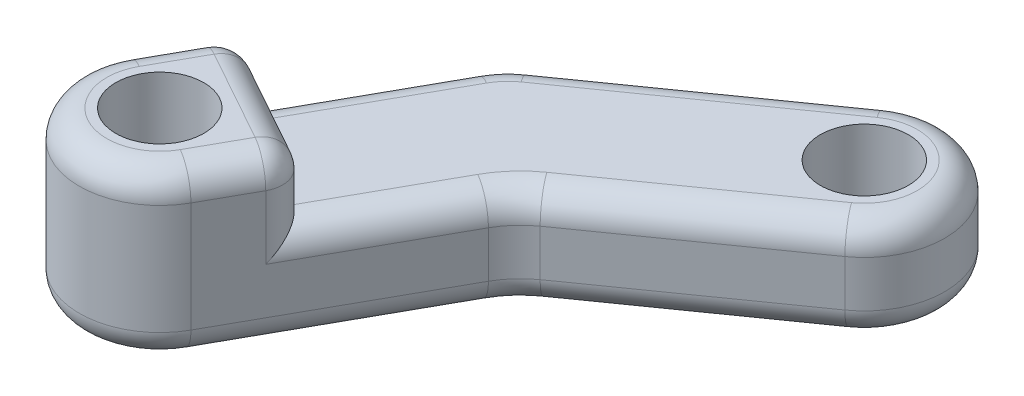
ISO-10303-21;
HEADER;
FILE_DESCRIPTION(('STEP AP214'),'2;1');
FILE_NAME('part.step','',(''),(''),'','','');
FILE_SCHEMA(('AUTOMOTIVE_DESIGN { 1 0 10303 214 1 1 1 1 }'));
ENDSEC;
DATA;
#1=APPLICATION_CONTEXT('core data for automotive mechanical design processes');
#2=APPLICATION_PROTOCOL_DEFINITION('international standard','automotive_design',2000,#1);
#3=PRODUCT_CONTEXT('',#1,'mechanical');
#4=PRODUCT('Part','Part','',(#3));
#5=PRODUCT_RELATED_PRODUCT_CATEGORY('part','',(#4));
#6=PRODUCT_DEFINITION_FORMATION('','',#4);
#7=PRODUCT_DEFINITION_CONTEXT('part definition',#1,'design');
#8=PRODUCT_DEFINITION('design','',#6,#7);
#9=PRODUCT_DEFINITION_SHAPE('','',#8);
#10=(LENGTH_UNIT() NAMED_UNIT(*) SI_UNIT(.MILLI.,.METRE.));
#11=(NAMED_UNIT(*) PLANE_ANGLE_UNIT() SI_UNIT($,.RADIAN.));
#12=(NAMED_UNIT(*) SI_UNIT($,.STERADIAN.) SOLID_ANGLE_UNIT());
#13=UNCERTAINTY_MEASURE_WITH_UNIT(LENGTH_MEASURE(1.E-05),#10,'distance_accuracy_value','');
#14=(GEOMETRIC_REPRESENTATION_CONTEXT(3) GLOBAL_UNCERTAINTY_ASSIGNED_CONTEXT((#13)) GLOBAL_UNIT_ASSIGNED_CONTEXT((#10,
#11,#12)) REPRESENTATION_CONTEXT('',''));
#15=CARTESIAN_POINT('',(0.,0.,0.));
#16=DIRECTION('',(0.,0.,1.));
#17=DIRECTION('',(1.,0.,0.));
#18=AXIS2_PLACEMENT_3D('',#15,#16,#17);
#19=CARTESIAN_POINT('',(-3.07792703036858,6.,42.5494077038995));
#20=DIRECTION('',(0.,1.,0.));
#21=DIRECTION('',(0.,0.,-1.));
#22=AXIS2_PLACEMENT_3D('',#19,#20,#21);
#23=PLANE('',#22);
#24=CARTESIAN_POINT('',(-12.1213283190201,6.,46.6088583943311));
#25=DIRECTION('',(0.,-1.,0.));
#26=DIRECTION('',(0.,0.,-1.));
#27=AXIS2_PLACEMENT_3D('',#24,#25,#26);
#28=CIRCLE('',#27,1.6);
#29=CARTESIAN_POINT('',(-12.1213283190201,6.,45.0088583943311));
#30=VERTEX_POINT('',#29);
#31=EDGE_CURVE('E217',#30,#30,#28,.T.);
#32=ORIENTED_EDGE('',*,*,#31,.T.);
#33=EDGE_LOOP('',(#32));
#34=FACE_BOUND('',#33,.T.);
#35=DIRECTION('',(0.48662327291121,0.,-0.873611922000371));
#36=VECTOR('',#35,1.);
#37=CARTESIAN_POINT('',(-9.2870002794277,6.,37.5646901203428));
#38=LINE('',#37,#36);
#39=CARTESIAN_POINT('',(-13.8030312688708,6.,45.672108593977));
#40=VERTEX_POINT('',#39);
#41=CARTESIAN_POINT('',(-12.8297847230484,6.,43.9248847499763));
#42=VERTEX_POINT('',#41);
#43=EDGE_CURVE('E223',#40,#42,#38,.T.);
#44=ORIENTED_EDGE('',*,*,#43,.F.);
#45=CARTESIAN_POINT('',(-12.1213283190201,6.,46.6088583943311));
#46=DIRECTION('',(0.,-1.,0.));
#47=DIRECTION('',(0.,0.,-1.));
#48=AXIS2_PLACEMENT_3D('',#45,#46,#47);
#49=CIRCLE('',#48,1.925);
#50=CARTESIAN_POINT('',(-10.4396253691694,6.,47.5456081946852));
#51=VERTEX_POINT('',#50);
#52=EDGE_CURVE('E230',#51,#40,#49,.T.);
#53=ORIENTED_EDGE('',*,*,#52,.F.);
#54=DIRECTION('',(-0.48662327291121,0.,0.873611922000371));
#55=VECTOR('',#54,1.);
#56=CARTESIAN_POINT('',(-10.4396253691694,6.,47.5456081946852));
#57=LINE('',#56,#55);
#58=CARTESIAN_POINT('',(-9.466378823347,6.,45.7983843506844));
#59=VERTEX_POINT('',#58);
#60=EDGE_CURVE('E347',#59,#51,#57,.T.);
#61=ORIENTED_EDGE('',*,*,#60,.F.);
#62=DIRECTION('',(0.873611922000371,0.,0.48662327291121));
#63=VECTOR('',#62,1.);
#64=CARTESIAN_POINT('',(-5.97193113534552,6.,47.7448774423293));
#65=LINE('',#64,#63);
#66=EDGE_CURVE('E297',#42,#59,#65,.T.);
#67=ORIENTED_EDGE('',*,*,#66,.F.);
#68=EDGE_LOOP('',(#44,#53,#61,#67));
#69=FACE_BOUND('',#68,.T.);
#70=ADVANCED_FACE('F41',(#34,#69),#23,.T.);
#71=CARTESIAN_POINT('',(-3.07792703036858,6.,42.5494077038995));
#72=DIRECTION('',(0.,-1.,0.));
#73=DIRECTION('',(0.,0.,1.));
#74=AXIS2_PLACEMENT_3D('',#71,#72,#73);
#75=CYLINDRICAL_SURFACE('',#74,3.);
#76=DIRECTION('',(0.,-1.,0.));
#77=VECTOR('',#76,1.);
#78=CARTESIAN_POINT('',(-5.69876279636969,6.,41.0895378851658));
#79=LINE('',#78,#77);
#80=CARTESIAN_POINT('',(-5.69876279636969,2.6825,41.0895378851658));
#81=VERTEX_POINT('',#80);
#82=CARTESIAN_POINT('',(-5.69876279636969,1.,41.0895378851658));
#83=VERTEX_POINT('',#82);
#84=EDGE_CURVE('E207',#81,#83,#79,.T.);
#85=ORIENTED_EDGE('',*,*,#84,.T.);
#86=CARTESIAN_POINT('',(-3.07792703036858,1.,42.5494077038995));
#87=DIRECTION('',(0.,-1.,0.));
#88=DIRECTION('',(0.,0.,-1.));
#89=AXIS2_PLACEMENT_3D('',#86,#87,#88);
#90=CIRCLE('',#89,3.);
#91=CARTESIAN_POINT('',(-4.80739443429938,1.,40.0980932608423));
#92=VERTEX_POINT('',#91);
#93=EDGE_CURVE('E186',#92,#83,#90,.F.);
#94=ORIENTED_EDGE('',*,*,#93,.F.);
#95=DIRECTION('',(0.,-1.,0.));
#96=VECTOR('',#95,1.);
#97=CARTESIAN_POINT('',(-4.80739443429938,6.,40.0980932608423));
#98=LINE('',#97,#96);
#99=CARTESIAN_POINT('',(-4.80739443429938,2.6825,40.0980932608423));
#100=VERTEX_POINT('',#99);
#101=EDGE_CURVE('E208',#100,#92,#98,.T.);
#102=ORIENTED_EDGE('',*,*,#101,.F.);
#103=CARTESIAN_POINT('',(-3.07792703036858,2.6825,42.5494077038995));
#104=DIRECTION('',(0.,-1.,0.));
#105=DIRECTION('',(0.,0.,-1.));
#106=AXIS2_PLACEMENT_3D('',#103,#104,#105);
#107=CIRCLE('',#106,3.);
#108=EDGE_CURVE('E277',#81,#100,#107,.T.);
#109=ORIENTED_EDGE('',*,*,#108,.F.);
#110=EDGE_LOOP('',(#85,#94,#102,#109));
#111=FACE_BOUND('',#110,.T.);
#112=ADVANCED_FACE('F219',(#111),#75,.F.);
#113=CARTESIAN_POINT('',(-9.56601344716905,6.,48.0322314675964));
#114=DIRECTION('',(-0.873611922000371,0.,-0.48662327291121));
#115=DIRECTION('',(0.48662327291121,0.,-0.873611922000371));
#116=AXIS2_PLACEMENT_3D('',#113,#114,#115);
#117=PLANE('',#116);
#118=DIRECTION('',(-0.48662327291121,0.,0.873611922000371));
#119=VECTOR('',#118,1.);
#120=CARTESIAN_POINT('',(-5.69876279636969,5.,41.0895378851658));
#121=LINE('',#120,#119);
#122=CARTESIAN_POINT('',(-9.56601344716905,5.,48.0322314675964));
#123=VERTEX_POINT('',#122);
#124=CARTESIAN_POINT('',(-8.59276690134663,5.,46.2850076235957));
#125=VERTEX_POINT('',#124);
#126=EDGE_CURVE('E338',#123,#125,#121,.F.);
#127=ORIENTED_EDGE('',*,*,#126,.F.);
#128=DIRECTION('',(0.,-1.,0.));
#129=VECTOR('',#128,1.);
#130=CARTESIAN_POINT('',(-9.56601344716905,6.,48.0322314675964));
#131=LINE('',#130,#129);
#132=CARTESIAN_POINT('',(-9.56601344716905,1.,48.0322314675964));
#133=VERTEX_POINT('',#132);
#134=EDGE_CURVE('E381',#123,#133,#131,.T.);
#135=ORIENTED_EDGE('',*,*,#134,.T.);
#136=DIRECTION('',(-0.48662327291121,0.,0.873611922000371));
#137=VECTOR('',#136,1.);
#138=CARTESIAN_POINT('',(-9.56601344716905,1.,48.0322314675964));
#139=LINE('',#138,#137);
#140=EDGE_CURVE('E345',#83,#133,#139,.T.);
#141=ORIENTED_EDGE('',*,*,#140,.F.);
#142=ORIENTED_EDGE('',*,*,#84,.F.);
#143=DIRECTION('',(0.48662327291121,0.,-0.873611922000371));
#144=VECTOR('',#143,1.);
#145=CARTESIAN_POINT('',(-5.69876279636969,2.6825,41.0895378851658));
#146=LINE('',#145,#144);
#147=CARTESIAN_POINT('',(-8.59276690134663,2.6825,46.2850076235957));
#148=VERTEX_POINT('',#147);
#149=EDGE_CURVE('E278',#148,#81,#146,.T.);
#150=ORIENTED_EDGE('',*,*,#149,.F.);
#151=DIRECTION('',(0.,1.,0.));
#152=VECTOR('',#151,1.);
#153=CARTESIAN_POINT('',(-8.59276690134663,2.6825,46.2850076235957));
#154=LINE('',#153,#152);
#155=EDGE_CURVE('E317',#125,#148,#154,.F.);
#156=ORIENTED_EDGE('',*,*,#155,.F.);
#157=EDGE_LOOP('',(#127,#135,#141,#142,#150,#156));
#158=FACE_BOUND('',#157,.T.);
#159=ADVANCED_FACE('F336',(#158),#117,.F.);
#160=CARTESIAN_POINT('',(-14.6766431908712,6.,45.1854853210658));
#161=DIRECTION('',(0.873611922000371,0.,0.48662327291121));
#162=DIRECTION('',(-0.48662327291121,0.,0.873611922000371));
#163=AXIS2_PLACEMENT_3D('',#160,#161,#162);
#164=PLANE('',#163);
#165=DIRECTION('',(-0.48662327291121,0.,0.873611922000371));
#166=VECTOR('',#165,1.);
#167=CARTESIAN_POINT('',(-13.2167733721376,2.6825,42.5646495550647));
#168=LINE('',#167,#166);
#169=CARTESIAN_POINT('',(-10.1606122014281,2.6825,37.0780668474316));
#170=VERTEX_POINT('',#169);
#171=CARTESIAN_POINT('',(-13.7033966450488,2.6825,43.4382614770651));
#172=VERTEX_POINT('',#171);
#173=EDGE_CURVE('E225',#170,#172,#168,.T.);
#174=ORIENTED_EDGE('',*,*,#173,.F.);
#175=DIRECTION('',(0.,-1.,0.));
#176=VECTOR('',#175,1.);
#177=CARTESIAN_POINT('',(-10.1606122014281,6.,37.0780668474316));
#178=LINE('',#177,#176);
#179=CARTESIAN_POINT('',(-10.1606122014281,1.,37.0780668474316));
#180=VERTEX_POINT('',#179);
#181=EDGE_CURVE('E383',#170,#180,#178,.T.);
#182=ORIENTED_EDGE('',*,*,#181,.T.);
#183=DIRECTION('',(0.48662327291121,0.,-0.873611922000371));
#184=VECTOR('',#183,1.);
#185=CARTESIAN_POINT('',(-14.6766431908712,1.,45.1854853210658));
#186=LINE('',#185,#184);
#187=CARTESIAN_POINT('',(-14.6766431908712,1.,45.1854853210658));
#188=VERTEX_POINT('',#187);
#189=EDGE_CURVE('E375',#188,#180,#186,.T.);
#190=ORIENTED_EDGE('',*,*,#189,.F.);
#191=DIRECTION('',(0.,-1.,0.));
#192=VECTOR('',#191,1.);
#193=CARTESIAN_POINT('',(-14.6766431908712,6.,45.1854853210658));
#194=LINE('',#193,#192);
#195=CARTESIAN_POINT('',(-14.6766431908712,5.,45.1854853210658));
#196=VERTEX_POINT('',#195);
#197=EDGE_CURVE('E380',#196,#188,#194,.T.);
#198=ORIENTED_EDGE('',*,*,#197,.F.);
#199=DIRECTION('',(0.48662327291121,0.,-0.873611922000371));
#200=VECTOR('',#199,1.);
#201=CARTESIAN_POINT('',(-14.6766431908712,5.,45.1854853210658));
#202=LINE('',#201,#200);
#203=CARTESIAN_POINT('',(-13.7033966450488,5.,43.4382614770651));
#204=VERTEX_POINT('',#203);
#205=EDGE_CURVE('E367',#204,#196,#202,.F.);
#206=ORIENTED_EDGE('',*,*,#205,.F.);
#207=DIRECTION('',(0.,1.,0.));
#208=VECTOR('',#207,1.);
#209=CARTESIAN_POINT('',(-13.7033966450488,5.,43.4382614770651));
#210=LINE('',#209,#208);
#211=EDGE_CURVE('E313',#172,#204,#210,.T.);
#212=ORIENTED_EDGE('',*,*,#211,.F.);
#213=EDGE_LOOP('',(#174,#182,#190,#198,#206,#212));
#214=FACE_BOUND('',#213,.T.);
#215=ADVANCED_FACE('F378',(#214),#164,.F.);
#216=CARTESIAN_POINT('',(-7.53977643542695,6.,38.5379366661653));
#217=DIRECTION('',(0.,-1.,0.));
#218=DIRECTION('',(0.,0.,1.));
#219=AXIS2_PLACEMENT_3D('',#216,#217,#218);
#220=CYLINDRICAL_SURFACE('',#219,3.);
#221=DIRECTION('',(0.,-1.,0.));
#222=VECTOR('',#221,1.);
#223=CARTESIAN_POINT('',(-9.26924383935776,6.,36.0866222231081));
#224=LINE('',#223,#222);
#225=CARTESIAN_POINT('',(-9.26924383935776,2.6825,36.0866222231081));
#226=VERTEX_POINT('',#225);
#227=CARTESIAN_POINT('',(-9.26924383935776,1.,36.0866222231081));
#228=VERTEX_POINT('',#227);
#229=EDGE_CURVE('E387',#226,#228,#224,.T.);
#230=ORIENTED_EDGE('',*,*,#229,.T.);
#231=CARTESIAN_POINT('',(-7.53977643542695,1.,38.5379366661653));
#232=DIRECTION('',(0.,-1.,0.));
#233=DIRECTION('',(0.,0.,-1.));
#234=AXIS2_PLACEMENT_3D('',#231,#232,#233);
#235=CIRCLE('',#234,3.);
#236=EDGE_CURVE('E373',#180,#228,#235,.T.);
#237=ORIENTED_EDGE('',*,*,#236,.F.);
#238=ORIENTED_EDGE('',*,*,#181,.F.);
#239=CARTESIAN_POINT('',(-7.53977643542695,2.6825,38.5379366661653));
#240=DIRECTION('',(0.,-1.,0.));
#241=DIRECTION('',(0.,0.,-1.));
#242=AXIS2_PLACEMENT_3D('',#239,#240,#241);
#243=CIRCLE('',#242,3.);
#244=EDGE_CURVE('E266',#226,#170,#243,.F.);
#245=ORIENTED_EDGE('',*,*,#244,.F.);
#246=EDGE_LOOP('',(#230,#237,#238,#245));
#247=FACE_BOUND('',#246,.T.);
#248=ADVANCED_FACE('F453',(#247),#220,.T.);
#249=CARTESIAN_POINT('',(-9.26924383935776,6.,36.0866222231081));
#250=DIRECTION('',(0.576489134643602,0.,0.817104814352401));
#251=DIRECTION('',(-0.817104814352401,0.,0.576489134643602));
#252=AXIS2_PLACEMENT_3D('',#249,#250,#251);
#253=PLANE('',#252);
#254=DIRECTION('',(0.,-1.,0.));
#255=VECTOR('',#254,1.);
#256=CARTESIAN_POINT('',(-1.68623071883253,6.,30.7366051933989));
#257=LINE('',#256,#255);
#258=CARTESIAN_POINT('',(-1.68623071883253,2.6825,30.7366051933989));
#259=VERTEX_POINT('',#258);
#260=CARTESIAN_POINT('',(-1.68623071883253,1.,30.7366051933989));
#261=VERTEX_POINT('',#260);
#262=EDGE_CURVE('E441',#259,#261,#257,.T.);
#263=ORIENTED_EDGE('',*,*,#262,.T.);
#264=DIRECTION('',(0.817104814352401,0.,-0.576489134643602));
#265=VECTOR('',#264,1.);
#266=CARTESIAN_POINT('',(-9.26924383935776,1.,36.0866222231081));
#267=LINE('',#266,#265);
#268=EDGE_CURVE('E417',#228,#261,#267,.T.);
#269=ORIENTED_EDGE('',*,*,#268,.F.);
#270=ORIENTED_EDGE('',*,*,#229,.F.);
#271=DIRECTION('',(-0.817104814352401,0.,0.576489134643602));
#272=VECTOR('',#271,1.);
#273=CARTESIAN_POINT('',(-9.26924383935776,2.6825,36.0866222231081));
#274=LINE('',#273,#272);
#275=EDGE_CURVE('E271',#259,#226,#274,.T.);
#276=ORIENTED_EDGE('',*,*,#275,.F.);
#277=EDGE_LOOP('',(#263,#269,#270,#276));
#278=FACE_BOUND('',#277,.T.);
#279=ADVANCED_FACE('F456',(#278),#253,.F.);
#280=CARTESIAN_POINT('',(0.,6.,33.1266367753797));
#281=DIRECTION('',(0.,-1.,0.));
#282=DIRECTION('',(0.,0.,1.));
#283=AXIS2_PLACEMENT_3D('',#280,#281,#282);
#284=CYLINDRICAL_SURFACE('',#283,2.925);
#285=DIRECTION('',(0.,-1.,0.));
#286=VECTOR('',#285,1.);
#287=CARTESIAN_POINT('',(1.68623071883253,6.,35.5166683573605));
#288=LINE('',#287,#286);
#289=CARTESIAN_POINT('',(1.68623071883253,2.6825,35.5166683573605));
#290=VERTEX_POINT('',#289);
#291=CARTESIAN_POINT('',(1.68623071883253,1.,35.5166683573605));
#292=VERTEX_POINT('',#291);
#293=EDGE_CURVE('E220',#290,#292,#288,.T.);
#294=ORIENTED_EDGE('',*,*,#293,.T.);
#295=CARTESIAN_POINT('',(0.,1.,33.1266367753797));
#296=DIRECTION('',(0.,-1.,0.));
#297=DIRECTION('',(0.,0.,-1.));
#298=AXIS2_PLACEMENT_3D('',#295,#296,#297);
#299=CIRCLE('',#298,2.925);
#300=EDGE_CURVE('E413',#261,#292,#299,.T.);
#301=ORIENTED_EDGE('',*,*,#300,.F.);
#302=ORIENTED_EDGE('',*,*,#262,.F.);
#303=CARTESIAN_POINT('',(0.,2.6825,33.1266367753797));
#304=DIRECTION('',(0.,-1.,0.));
#305=DIRECTION('',(0.,0.,-1.));
#306=AXIS2_PLACEMENT_3D('',#303,#304,#305);
#307=CIRCLE('',#306,2.925);
#308=EDGE_CURVE('E281',#290,#259,#307,.F.);
#309=ORIENTED_EDGE('',*,*,#308,.F.);
#310=EDGE_LOOP('',(#294,#301,#302,#309));
#311=FACE_BOUND('',#310,.T.);
#312=ADVANCED_FACE('F439',(#311),#284,.T.);
#313=CARTESIAN_POINT('',(-4.80739443429938,6.,40.0980932608423));
#314=DIRECTION('',(-0.576489134643602,0.,-0.817104814352401));
#315=DIRECTION('',(0.817104814352401,0.,-0.576489134643602));
#316=AXIS2_PLACEMENT_3D('',#313,#314,#315);
#317=PLANE('',#316);
#318=ORIENTED_EDGE('',*,*,#101,.T.);
#319=DIRECTION('',(-0.817104814352401,0.,0.576489134643602));
#320=VECTOR('',#319,1.);
#321=CARTESIAN_POINT('',(-4.80739443429938,1.,40.0980932608423));
#322=LINE('',#321,#320);
#323=EDGE_CURVE('E199',#292,#92,#322,.T.);
#324=ORIENTED_EDGE('',*,*,#323,.F.);
#325=ORIENTED_EDGE('',*,*,#293,.F.);
#326=DIRECTION('',(0.817104814352401,0.,-0.576489134643602));
#327=VECTOR('',#326,1.);
#328=CARTESIAN_POINT('',(1.68623071883253,2.6825,35.5166683573605));
#329=LINE('',#328,#327);
#330=EDGE_CURVE('E212',#100,#290,#329,.T.);
#331=ORIENTED_EDGE('',*,*,#330,.F.);
#332=EDGE_LOOP('',(#318,#324,#325,#331));
#333=FACE_BOUND('',#332,.T.);
#334=ADVANCED_FACE('F213',(#333),#317,.F.);
#335=CARTESIAN_POINT('',(0.,6.,33.1266367753797));
#336=DIRECTION('',(0.,-1.,0.));
#337=DIRECTION('',(0.,0.,1.));
#338=AXIS2_PLACEMENT_3D('',#335,#336,#337);
#339=CYLINDRICAL_SURFACE('',#338,1.6);
#340=CARTESIAN_POINT('',(0.,0.,33.1266367753797));
#341=DIRECTION('',(0.,-1.,0.));
#342=DIRECTION('',(0.,0.,-1.));
#343=AXIS2_PLACEMENT_3D('',#340,#341,#342);
#344=CIRCLE('',#343,1.6);
#345=CARTESIAN_POINT('',(0.,0.,31.5266367753797));
#346=VERTEX_POINT('',#345);
#347=EDGE_CURVE('E246',#346,#346,#344,.T.);
#348=ORIENTED_EDGE('',*,*,#347,.T.);
#349=EDGE_LOOP('',(#348));
#350=FACE_BOUND('',#349,.T.);
#351=CARTESIAN_POINT('',(0.,3.6825,33.1266367753797));
#352=DIRECTION('',(0.,-1.,0.));
#353=DIRECTION('',(0.,0.,-1.));
#354=AXIS2_PLACEMENT_3D('',#351,#352,#353);
#355=CIRCLE('',#354,1.6);
#356=CARTESIAN_POINT('',(0.,3.6825,31.5266367753797));
#357=VERTEX_POINT('',#356);
#358=EDGE_CURVE('E248',#357,#357,#355,.F.);
#359=ORIENTED_EDGE('',*,*,#358,.T.);
#360=EDGE_LOOP('',(#359));
#361=FACE_BOUND('',#360,.T.);
#362=ADVANCED_FACE('F512',(#350,#361),#339,.F.);
#363=CARTESIAN_POINT('',(-9.93578061807149,5.,38.7294150115465));
#364=DIRECTION('',(-0.48662327291121,0.,0.873611922000371));
#365=DIRECTION('',(-0.873611922000371,0.,-0.48662327291121));
#366=AXIS2_PLACEMENT_3D('',#363,#364,#365);
#367=CYLINDRICAL_SURFACE('',#366,1.);
#368=ORIENTED_EDGE('',*,*,#205,.T.);
#369=CARTESIAN_POINT('',(-13.8030312688708,5.,45.672108593977));
#370=DIRECTION('',(0.486623272911209,0.,-0.873611922000371));
#371=DIRECTION('',(-0.873611922000371,0.,-0.486623272911209));
#372=AXIS2_PLACEMENT_3D('',#369,#370,#371);
#373=CIRCLE('',#372,1.);
#374=EDGE_CURVE('E200',#196,#40,#373,.T.);
#375=ORIENTED_EDGE('',*,*,#374,.T.);
#376=ORIENTED_EDGE('',*,*,#43,.T.);
#377=CARTESIAN_POINT('',(-12.8297847230484,5.,43.9248847499763));
#378=DIRECTION('',(0.48662327291121,0.,-0.873611922000371));
#379=DIRECTION('',(-0.873611922000371,0.,-0.48662327291121));
#380=AXIS2_PLACEMENT_3D('',#377,#378,#379);
#381=CIRCLE('',#380,1.);
#382=EDGE_CURVE('E283',#204,#42,#381,.T.);
#383=ORIENTED_EDGE('',*,*,#382,.F.);
#384=EDGE_LOOP('',(#368,#375,#376,#383));
#385=FACE_BOUND('',#384,.T.);
#386=ADVANCED_FACE('F370',(#385),#367,.T.);
#387=CARTESIAN_POINT('',(-6.57237471837006,5.,40.6029146122546));
#388=DIRECTION('',(0.48662327291121,0.,-0.873611922000371));
#389=DIRECTION('',(0.873611922000371,0.,0.48662327291121));
#390=AXIS2_PLACEMENT_3D('',#387,#388,#389);
#391=CYLINDRICAL_SURFACE('',#390,1.);
#392=ORIENTED_EDGE('',*,*,#60,.T.);
#393=CARTESIAN_POINT('',(-10.4396253691694,5.,47.5456081946852));
#394=DIRECTION('',(-0.486623272911209,0.,0.873611922000371));
#395=DIRECTION('',(0.873611922000371,0.,0.486623272911209));
#396=AXIS2_PLACEMENT_3D('',#393,#394,#395);
#397=CIRCLE('',#396,1.);
#398=EDGE_CURVE('E250',#123,#51,#397,.T.);
#399=ORIENTED_EDGE('',*,*,#398,.F.);
#400=ORIENTED_EDGE('',*,*,#126,.T.);
#401=CARTESIAN_POINT('',(-9.466378823347,5.,45.7983843506844));
#402=DIRECTION('',(-0.48662327291121,0.,0.873611922000371));
#403=DIRECTION('',(0.873611922000371,0.,0.48662327291121));
#404=AXIS2_PLACEMENT_3D('',#401,#402,#403);
#405=CIRCLE('',#404,1.);
#406=EDGE_CURVE('E311',#59,#125,#405,.F.);
#407=ORIENTED_EDGE('',*,*,#406,.F.);
#408=EDGE_LOOP('',(#392,#399,#400,#407));
#409=FACE_BOUND('',#408,.T.);
#410=ADVANCED_FACE('F344',(#409),#391,.T.);
#411=CARTESIAN_POINT('',(-3.07792703036858,0.,42.5494077038995));
#412=DIRECTION('',(0.,1.,0.));
#413=DIRECTION('',(0.,0.,-1.));
#414=AXIS2_PLACEMENT_3D('',#411,#412,#413);
#415=PLANE('',#414);
#416=CARTESIAN_POINT('',(-3.07792703036858,0.,42.5494077038995));
#417=DIRECTION('',(0.,-1.,0.));
#418=DIRECTION('',(0.,0.,-1.));
#419=AXIS2_PLACEMENT_3D('',#416,#417,#418);
#420=CIRCLE('',#419,4.);
#421=CARTESIAN_POINT('',(-6.57237471837006,0.,40.6029146122546));
#422=VERTEX_POINT('',#421);
#423=CARTESIAN_POINT('',(-5.38388356894299,0.,39.2809884464899));
#424=VERTEX_POINT('',#423);
#425=EDGE_CURVE('E194',#422,#424,#420,.T.);
#426=ORIENTED_EDGE('',*,*,#425,.F.);
#427=DIRECTION('',(-0.48662327291121,0.,0.873611922000371));
#428=VECTOR('',#427,1.);
#429=CARTESIAN_POINT('',(-6.57237471837006,0.,40.6029146122546));
#430=LINE('',#429,#428);
#431=CARTESIAN_POINT('',(-10.4396253691694,0.,47.5456081946852));
#432=VERTEX_POINT('',#431);
#433=EDGE_CURVE('E393',#432,#422,#430,.F.);
#434=ORIENTED_EDGE('',*,*,#433,.F.);
#435=CARTESIAN_POINT('',(-12.1213283190201,0.,46.6088583943311));
#436=DIRECTION('',(0.,-1.,0.));
#437=DIRECTION('',(0.,0.,-1.));
#438=AXIS2_PLACEMENT_3D('',#435,#436,#437);
#439=CIRCLE('',#438,1.925);
#440=CARTESIAN_POINT('',(-13.8030312688708,0.,45.672108593977));
#441=VERTEX_POINT('',#440);
#442=EDGE_CURVE('E400',#441,#432,#439,.F.);
#443=ORIENTED_EDGE('',*,*,#442,.F.);
#444=DIRECTION('',(0.48662327291121,0.,-0.873611922000371));
#445=VECTOR('',#444,1.);
#446=CARTESIAN_POINT('',(-9.93578061807149,0.,38.7294150115465));
#447=LINE('',#446,#445);
#448=CARTESIAN_POINT('',(-9.2870002794277,0.,37.5646901203428));
#449=VERTEX_POINT('',#448);
#450=EDGE_CURVE('E396',#449,#441,#447,.F.);
#451=ORIENTED_EDGE('',*,*,#450,.F.);
#452=CARTESIAN_POINT('',(-7.53977643542695,0.,38.5379366661653));
#453=DIRECTION('',(0.,-1.,0.));
#454=DIRECTION('',(0.,0.,-1.));
#455=AXIS2_PLACEMENT_3D('',#452,#453,#454);
#456=CIRCLE('',#455,2.);
#457=CARTESIAN_POINT('',(-8.69275470471416,0.,36.9037270374605));
#458=VERTEX_POINT('',#457);
#459=EDGE_CURVE('E401',#458,#449,#456,.F.);
#460=ORIENTED_EDGE('',*,*,#459,.F.);
#461=DIRECTION('',(0.817104814352401,0.,-0.576489134643602));
#462=VECTOR('',#461,1.);
#463=CARTESIAN_POINT('',(-7.60336673732085,0.,36.1351349112331));
#464=LINE('',#463,#462);
#465=CARTESIAN_POINT('',(-1.10974158418893,0.,31.5537100077513));
#466=VERTEX_POINT('',#465);
#467=EDGE_CURVE('E408',#466,#458,#464,.F.);
#468=ORIENTED_EDGE('',*,*,#467,.F.);
#469=CARTESIAN_POINT('',(0.,0.,33.1266367753797));
#470=DIRECTION('',(0.,-1.,0.));
#471=DIRECTION('',(0.,0.,-1.));
#472=AXIS2_PLACEMENT_3D('',#469,#470,#471);
#473=CIRCLE('',#472,1.925);
#474=CARTESIAN_POINT('',(1.10974158418893,0.,34.6995635430081));
#475=VERTEX_POINT('',#474);
#476=EDGE_CURVE('E410',#475,#466,#473,.F.);
#477=ORIENTED_EDGE('',*,*,#476,.F.);
#478=DIRECTION('',(-0.817104814352401,0.,0.576489134643602));
#479=VECTOR('',#478,1.);
#480=CARTESIAN_POINT('',(-5.38388356894299,0.,39.2809884464899));
#481=LINE('',#480,#479);
#482=EDGE_CURVE('E415',#424,#475,#481,.F.);
#483=ORIENTED_EDGE('',*,*,#482,.F.);
#484=EDGE_LOOP('',(#426,#434,#443,#451,#460,#468,#477,#483));
#485=FACE_BOUND('',#484,.T.);
#486=CARTESIAN_POINT('',(-12.1213283190201,0.,46.6088583943311));
#487=DIRECTION('',(0.,-1.,0.));
#488=DIRECTION('',(0.,0.,-1.));
#489=AXIS2_PLACEMENT_3D('',#486,#487,#488);
#490=CIRCLE('',#489,1.6);
#491=CARTESIAN_POINT('',(-12.1213283190201,0.,45.0088583943311));
#492=VERTEX_POINT('',#491);
#493=EDGE_CURVE('E807',#492,#492,#490,.T.);
#494=ORIENTED_EDGE('',*,*,#493,.F.);
#495=EDGE_LOOP('',(#494));
#496=FACE_BOUND('',#495,.T.);
#497=ORIENTED_EDGE('',*,*,#347,.F.);
#498=EDGE_LOOP('',(#497));
#499=FACE_BOUND('',#498,.T.);
#500=ADVANCED_FACE('F426',(#485,#496,#499),#415,.F.);
#501=CARTESIAN_POINT('',(-12.1213283190201,6.,46.6088583943311));
#502=DIRECTION('',(0.,-1.,0.));
#503=DIRECTION('',(0.,0.,1.));
#504=AXIS2_PLACEMENT_3D('',#501,#502,#503);
#505=CYLINDRICAL_SURFACE('',#504,2.925);
#506=ORIENTED_EDGE('',*,*,#134,.F.);
#507=CARTESIAN_POINT('',(-12.1213283190201,5.,46.6088583943311));
#508=DIRECTION('',(0.,-1.,0.));
#509=DIRECTION('',(0.,0.,-1.));
#510=AXIS2_PLACEMENT_3D('',#507,#508,#509);
#511=CIRCLE('',#510,2.925);
#512=EDGE_CURVE('E352',#196,#123,#511,.F.);
#513=ORIENTED_EDGE('',*,*,#512,.F.);
#514=ORIENTED_EDGE('',*,*,#197,.T.);
#515=CARTESIAN_POINT('',(-12.1213283190201,1.,46.6088583943311));
#516=DIRECTION('',(0.,-1.,0.));
#517=DIRECTION('',(0.,0.,-1.));
#518=AXIS2_PLACEMENT_3D('',#515,#516,#517);
#519=CIRCLE('',#518,2.925);
#520=EDGE_CURVE('E341',#133,#188,#519,.T.);
#521=ORIENTED_EDGE('',*,*,#520,.F.);
#522=EDGE_LOOP('',(#506,#513,#514,#521));
#523=FACE_BOUND('',#522,.T.);
#524=ADVANCED_FACE('F423',(#523),#505,.T.);
#525=CARTESIAN_POINT('',(-12.1213283190201,6.,46.6088583943311));
#526=DIRECTION('',(0.,-1.,0.));
#527=DIRECTION('',(0.,0.,1.));
#528=AXIS2_PLACEMENT_3D('',#525,#526,#527);
#529=CYLINDRICAL_SURFACE('',#528,1.6);
#530=ORIENTED_EDGE('',*,*,#31,.F.);
#531=EDGE_LOOP('',(#530));
#532=FACE_BOUND('',#531,.T.);
#533=ORIENTED_EDGE('',*,*,#493,.T.);
#534=EDGE_LOOP('',(#533));
#535=FACE_BOUND('',#534,.T.);
#536=ADVANCED_FACE('F504',(#532,#535),#529,.F.);
#537=CARTESIAN_POINT('',(-13.8030312688708,1.,45.672108593977));
#538=DIRECTION('',(0.48662327291121,0.,-0.873611922000371));
#539=DIRECTION('',(0.873611922000371,0.,0.48662327291121));
#540=AXIS2_PLACEMENT_3D('',#537,#538,#539);
#541=CYLINDRICAL_SURFACE('',#540,1.);
#542=CARTESIAN_POINT('',(-13.8030312688708,1.,45.672108593977));
#543=DIRECTION('',(0.486623272911209,0.,-0.873611922000371));
#544=DIRECTION('',(-0.873611922000371,0.,-0.486623272911209));
#545=AXIS2_PLACEMENT_3D('',#542,#543,#544);
#546=CIRCLE('',#545,1.);
#547=EDGE_CURVE('E245',#441,#188,#546,.T.);
#548=ORIENTED_EDGE('',*,*,#547,.T.);
#549=ORIENTED_EDGE('',*,*,#189,.T.);
#550=CARTESIAN_POINT('',(-9.2870002794277,1.,37.5646901203428));
#551=DIRECTION('',(-0.486623272911209,0.,0.873611922000371));
#552=DIRECTION('',(0.873611922000371,0.,0.486623272911209));
#553=AXIS2_PLACEMENT_3D('',#550,#551,#552);
#554=CIRCLE('',#553,1.);
#555=EDGE_CURVE('E242',#180,#449,#554,.T.);
#556=ORIENTED_EDGE('',*,*,#555,.T.);
#557=ORIENTED_EDGE('',*,*,#450,.T.);
#558=EDGE_LOOP('',(#548,#549,#556,#557));
#559=FACE_BOUND('',#558,.T.);
#560=ADVANCED_FACE('F465',(#559),#541,.T.);
#561=CARTESIAN_POINT('',(-7.53977643542695,1.,38.5379366661653));
#562=DIRECTION('',(0.,1.,0.));
#563=DIRECTION('',(0.,0.,-1.));
#564=AXIS2_PLACEMENT_3D('',#561,#562,#563);
#565=TOROIDAL_SURFACE('',#564,2.,1.);
#566=ORIENTED_EDGE('',*,*,#555,.F.);
#567=ORIENTED_EDGE('',*,*,#236,.T.);
#568=CARTESIAN_POINT('',(-8.69275470471416,1.,36.9037270374605));
#569=DIRECTION('',(-0.8171048143524,0.,0.576489134643603));
#570=DIRECTION('',(0.576489134643603,0.,0.8171048143524));
#571=AXIS2_PLACEMENT_3D('',#568,#569,#570);
#572=CIRCLE('',#571,1.);
#573=EDGE_CURVE('E239',#228,#458,#572,.T.);
#574=ORIENTED_EDGE('',*,*,#573,.T.);
#575=ORIENTED_EDGE('',*,*,#459,.T.);
#576=EDGE_LOOP('',(#566,#567,#574,#575));
#577=FACE_BOUND('',#576,.T.);
#578=ADVANCED_FACE('F458',(#577),#565,.T.);
#579=CARTESIAN_POINT('',(-12.1213283190201,1.,46.6088583943311));
#580=DIRECTION('',(0.,1.,0.));
#581=DIRECTION('',(0.,0.,-1.));
#582=AXIS2_PLACEMENT_3D('',#579,#580,#581);
#583=TOROIDAL_SURFACE('',#582,1.925,1.);
#584=ORIENTED_EDGE('',*,*,#547,.F.);
#585=ORIENTED_EDGE('',*,*,#442,.T.);
#586=CARTESIAN_POINT('',(-10.4396253691694,1.,47.5456081946852));
#587=DIRECTION('',(-0.486623272911209,0.,0.873611922000371));
#588=DIRECTION('',(0.873611922000371,0.,0.486623272911209));
#589=AXIS2_PLACEMENT_3D('',#586,#587,#588);
#590=CIRCLE('',#589,1.);
#591=EDGE_CURVE('E238',#432,#133,#590,.T.);
#592=ORIENTED_EDGE('',*,*,#591,.T.);
#593=ORIENTED_EDGE('',*,*,#520,.T.);
#594=EDGE_LOOP('',(#584,#585,#592,#593));
#595=FACE_BOUND('',#594,.T.);
#596=ADVANCED_FACE('F533',(#595),#583,.T.);
#597=CARTESIAN_POINT('',(-8.69275470471416,1.,36.9037270374605));
#598=DIRECTION('',(0.817104814352401,0.,-0.576489134643602));
#599=DIRECTION('',(0.576489134643602,0.,0.817104814352401));
#600=AXIS2_PLACEMENT_3D('',#597,#598,#599);
#601=CYLINDRICAL_SURFACE('',#600,1.);
#602=ORIENTED_EDGE('',*,*,#573,.F.);
#603=ORIENTED_EDGE('',*,*,#268,.T.);
#604=CARTESIAN_POINT('',(-1.10974158418893,1.,31.5537100077513));
#605=DIRECTION('',(-0.817104814352401,0.,0.576489134643602));
#606=DIRECTION('',(0.576489134643602,0.,0.817104814352401));
#607=AXIS2_PLACEMENT_3D('',#604,#605,#606);
#608=CIRCLE('',#607,1.);
#609=EDGE_CURVE('E236',#261,#466,#608,.T.);
#610=ORIENTED_EDGE('',*,*,#609,.T.);
#611=ORIENTED_EDGE('',*,*,#467,.T.);
#612=EDGE_LOOP('',(#602,#603,#610,#611));
#613=FACE_BOUND('',#612,.T.);
#614=ADVANCED_FACE('F535',(#613),#601,.T.);
#615=CARTESIAN_POINT('',(-10.4396253691694,1.,47.5456081946852));
#616=DIRECTION('',(-0.48662327291121,0.,0.873611922000371));
#617=DIRECTION('',(-0.873611922000371,0.,-0.48662327291121));
#618=AXIS2_PLACEMENT_3D('',#615,#616,#617);
#619=CYLINDRICAL_SURFACE('',#618,1.);
#620=ORIENTED_EDGE('',*,*,#591,.F.);
#621=ORIENTED_EDGE('',*,*,#433,.T.);
#622=CARTESIAN_POINT('',(-6.57237471837006,1.,40.6029146122546));
#623=DIRECTION('',(-0.48662327291121,0.,0.873611922000371));
#624=DIRECTION('',(0.873611922000371,0.,0.48662327291121));
#625=AXIS2_PLACEMENT_3D('',#622,#623,#624);
#626=CIRCLE('',#625,1.);
#627=EDGE_CURVE('E234',#422,#83,#626,.T.);
#628=ORIENTED_EDGE('',*,*,#627,.T.);
#629=ORIENTED_EDGE('',*,*,#140,.T.);
#630=EDGE_LOOP('',(#620,#621,#628,#629));
#631=FACE_BOUND('',#630,.T.);
#632=ADVANCED_FACE('F425',(#631),#619,.T.);
#633=CARTESIAN_POINT('',(0.,1.,33.1266367753797));
#634=DIRECTION('',(0.,1.,0.));
#635=DIRECTION('',(0.,0.,-1.));
#636=AXIS2_PLACEMENT_3D('',#633,#634,#635);
#637=TOROIDAL_SURFACE('',#636,1.925,1.);
#638=ORIENTED_EDGE('',*,*,#609,.F.);
#639=ORIENTED_EDGE('',*,*,#300,.T.);
#640=CARTESIAN_POINT('',(1.10974158418893,1.,34.6995635430081));
#641=DIRECTION('',(0.817104814352401,0.,-0.576489134643601));
#642=DIRECTION('',(-0.576489134643601,0.,-0.817104814352401));
#643=AXIS2_PLACEMENT_3D('',#640,#641,#642);
#644=CIRCLE('',#643,1.);
#645=EDGE_CURVE('E196',#292,#475,#644,.T.);
#646=ORIENTED_EDGE('',*,*,#645,.T.);
#647=ORIENTED_EDGE('',*,*,#476,.T.);
#648=EDGE_LOOP('',(#638,#639,#646,#647));
#649=FACE_BOUND('',#648,.T.);
#650=ADVANCED_FACE('F432',(#649),#637,.T.);
#651=CARTESIAN_POINT('',(-3.07792703036858,1.,42.5494077038995));
#652=DIRECTION('',(0.,1.,0.));
#653=DIRECTION('',(0.,0.,-1.));
#654=AXIS2_PLACEMENT_3D('',#651,#652,#653);
#655=TOROIDAL_SURFACE('',#654,4.,1.);
#656=ORIENTED_EDGE('',*,*,#627,.F.);
#657=ORIENTED_EDGE('',*,*,#425,.T.);
#658=CARTESIAN_POINT('',(-5.38388356894299,1.,39.2809884464899));
#659=DIRECTION('',(-0.8171048143524,0.,0.576489134643602));
#660=DIRECTION('',(0.576489134643602,0.,0.8171048143524));
#661=AXIS2_PLACEMENT_3D('',#658,#659,#660);
#662=CIRCLE('',#661,1.);
#663=EDGE_CURVE('E184',#424,#92,#662,.T.);
#664=ORIENTED_EDGE('',*,*,#663,.T.);
#665=ORIENTED_EDGE('',*,*,#93,.T.);
#666=EDGE_LOOP('',(#656,#657,#664,#665));
#667=FACE_BOUND('',#666,.T.);
#668=ADVANCED_FACE('F190',(#667),#655,.T.);
#669=CARTESIAN_POINT('',(-5.38388356894299,1.,39.2809884464899));
#670=DIRECTION('',(-0.817104814352401,0.,0.576489134643602));
#671=DIRECTION('',(-0.576489134643602,0.,-0.817104814352401));
#672=AXIS2_PLACEMENT_3D('',#669,#670,#671);
#673=CYLINDRICAL_SURFACE('',#672,1.);
#674=ORIENTED_EDGE('',*,*,#645,.F.);
#675=ORIENTED_EDGE('',*,*,#323,.T.);
#676=ORIENTED_EDGE('',*,*,#663,.F.);
#677=ORIENTED_EDGE('',*,*,#482,.T.);
#678=EDGE_LOOP('',(#674,#675,#676,#677));
#679=FACE_BOUND('',#678,.T.);
#680=ADVANCED_FACE('F205',(#679),#673,.T.);
#681=CARTESIAN_POINT('',(-12.1213283190201,5.,46.6088583943311));
#682=DIRECTION('',(0.,1.,0.));
#683=DIRECTION('',(0.,0.,-1.));
#684=AXIS2_PLACEMENT_3D('',#681,#682,#683);
#685=TOROIDAL_SURFACE('',#684,1.925,1.);
#686=ORIENTED_EDGE('',*,*,#374,.F.);
#687=ORIENTED_EDGE('',*,*,#512,.T.);
#688=ORIENTED_EDGE('',*,*,#398,.T.);
#689=ORIENTED_EDGE('',*,*,#52,.T.);
#690=EDGE_LOOP('',(#686,#687,#688,#689));
#691=FACE_BOUND('',#690,.T.);
#692=ADVANCED_FACE('F359',(#691),#685,.T.);
#693=CARTESIAN_POINT('',(-7.14204812069961,3.6825,45.9484205515986));
#694=DIRECTION('',(0.48662327291121,0.,-0.873611922000371));
#695=DIRECTION('',(0.873611922000371,0.,0.48662327291121));
#696=AXIS2_PLACEMENT_3D('',#693,#694,#695);
#697=PLANE('',#696);
#698=DIRECTION('',(0.873611922000371,0.,0.48662327291121));
#699=VECTOR('',#698,1.);
#700=CARTESIAN_POINT('',(-7.14204812069961,5.,45.9484205515986));
#701=LINE('',#700,#699);
#702=CARTESIAN_POINT('',(-8.97975555043579,5.,44.9247724286841));
#703=VERTEX_POINT('',#702);
#704=CARTESIAN_POINT('',(-12.3431614501372,5.,43.0512728279759));
#705=VERTEX_POINT('',#704);
#706=EDGE_CURVE('E306',#703,#705,#701,.F.);
#707=ORIENTED_EDGE('',*,*,#706,.F.);
#708=DIRECTION('',(0.,1.,0.));
#709=VECTOR('',#708,1.);
#710=CARTESIAN_POINT('',(-8.97975555043579,5.,44.9247724286841));
#711=LINE('',#710,#709);
#712=CARTESIAN_POINT('',(-8.97975555043579,3.6825,44.9247724286841));
#713=VERTEX_POINT('',#712);
#714=EDGE_CURVE('E303',#713,#703,#711,.T.);
#715=ORIENTED_EDGE('',*,*,#714,.F.);
#716=DIRECTION('',(0.873611922000371,0.,0.48662327291121));
#717=VECTOR('',#716,1.);
#718=CARTESIAN_POINT('',(-7.14204812069961,3.6825,45.9484205515986));
#719=LINE('',#718,#717);
#720=CARTESIAN_POINT('',(-12.3431614501372,3.6825,43.0512728279759));
#721=VERTEX_POINT('',#720);
#722=EDGE_CURVE('E300',#721,#713,#719,.T.);
#723=ORIENTED_EDGE('',*,*,#722,.F.);
#724=DIRECTION('',(0.,1.,0.));
#725=VECTOR('',#724,1.);
#726=CARTESIAN_POINT('',(-12.3431614501372,2.6825,43.0512728279759));
#727=LINE('',#726,#725);
#728=EDGE_CURVE('E307',#705,#721,#727,.F.);
#729=ORIENTED_EDGE('',*,*,#728,.F.);
#730=EDGE_LOOP('',(#707,#715,#723,#729));
#731=FACE_BOUND('',#730,.T.);
#732=ADVANCED_FACE('F493',(#731),#697,.T.);
#733=CARTESIAN_POINT('',(0.,3.6825,33.1266367753797));
#734=DIRECTION('',(0.,1.,0.));
#735=DIRECTION('',(0.,0.,-1.));
#736=AXIS2_PLACEMENT_3D('',#733,#734,#735);
#737=PLANE('',#736);
#738=ORIENTED_EDGE('',*,*,#722,.T.);
#739=DIRECTION('',(0.48662327291121,0.,-0.873611922000371));
#740=VECTOR('',#739,1.);
#741=CARTESIAN_POINT('',(-8.97975555043579,3.6825,44.9247724286841));
#742=LINE('',#741,#740);
#743=CARTESIAN_POINT('',(-6.57237471837006,3.6825,40.6029146122546));
#744=VERTEX_POINT('',#743);
#745=EDGE_CURVE('E260',#744,#713,#742,.F.);
#746=ORIENTED_EDGE('',*,*,#745,.F.);
#747=CARTESIAN_POINT('',(-3.07792703036858,3.6825,42.5494077038995));
#748=DIRECTION('',(0.,-1.,0.));
#749=DIRECTION('',(0.,0.,-1.));
#750=AXIS2_PLACEMENT_3D('',#747,#748,#749);
#751=CIRCLE('',#750,4.);
#752=CARTESIAN_POINT('',(-5.38388356894299,3.6825,39.2809884464899));
#753=VERTEX_POINT('',#752);
#754=EDGE_CURVE('E258',#753,#744,#751,.F.);
#755=ORIENTED_EDGE('',*,*,#754,.F.);
#756=DIRECTION('',(0.817104814352401,0.,-0.576489134643602));
#757=VECTOR('',#756,1.);
#758=CARTESIAN_POINT('',(-5.38388356894299,3.6825,39.2809884464899));
#759=LINE('',#758,#757);
#760=CARTESIAN_POINT('',(1.10974158418893,3.6825,34.6995635430081));
#761=VERTEX_POINT('',#760);
#762=EDGE_CURVE('E254',#761,#753,#759,.F.);
#763=ORIENTED_EDGE('',*,*,#762,.F.);
#764=CARTESIAN_POINT('',(0.,3.6825,33.1266367753797));
#765=DIRECTION('',(0.,-1.,0.));
#766=DIRECTION('',(0.,0.,-1.));
#767=AXIS2_PLACEMENT_3D('',#764,#765,#766);
#768=CIRCLE('',#767,1.925);
#769=CARTESIAN_POINT('',(-1.10974158418893,3.6825,31.5537100077513));
#770=VERTEX_POINT('',#769);
#771=EDGE_CURVE('E228',#770,#761,#768,.T.);
#772=ORIENTED_EDGE('',*,*,#771,.F.);
#773=DIRECTION('',(-0.817104814352401,0.,0.576489134643602));
#774=VECTOR('',#773,1.);
#775=CARTESIAN_POINT('',(-1.10974158418893,3.6825,31.5537100077513));
#776=LINE('',#775,#774);
#777=CARTESIAN_POINT('',(-8.69275470471416,3.6825,36.9037270374605));
#778=VERTEX_POINT('',#777);
#779=EDGE_CURVE('E261',#778,#770,#776,.F.);
#780=ORIENTED_EDGE('',*,*,#779,.F.);
#781=CARTESIAN_POINT('',(-7.53977643542695,3.6825,38.5379366661653));
#782=DIRECTION('',(0.,-1.,0.));
#783=DIRECTION('',(0.,0.,-1.));
#784=AXIS2_PLACEMENT_3D('',#781,#782,#783);
#785=CIRCLE('',#784,2.);
#786=CARTESIAN_POINT('',(-9.2870002794277,3.6825,37.5646901203428));
#787=VERTEX_POINT('',#786);
#788=EDGE_CURVE('E263',#787,#778,#785,.T.);
#789=ORIENTED_EDGE('',*,*,#788,.F.);
#790=DIRECTION('',(-0.48662327291121,0.,0.873611922000371));
#791=VECTOR('',#790,1.);
#792=CARTESIAN_POINT('',(-9.2870002794277,3.6825,37.5646901203428));
#793=LINE('',#792,#791);
#794=EDGE_CURVE('E270',#721,#787,#793,.F.);
#795=ORIENTED_EDGE('',*,*,#794,.F.);
#796=EDGE_LOOP('',(#738,#746,#755,#763,#772,#780,#789,#795));
#797=FACE_BOUND('',#796,.T.);
#798=ORIENTED_EDGE('',*,*,#358,.F.);
#799=EDGE_LOOP('',(#798));
#800=FACE_BOUND('',#799,.T.);
#801=ADVANCED_FACE('F484',(#797,#800),#737,.T.);
#802=CARTESIAN_POINT('',(-10.4396253691694,2.6825,47.5456081946852));
#803=DIRECTION('',(-0.48662327291121,0.,0.873611922000371));
#804=DIRECTION('',(-0.873611922000371,0.,-0.48662327291121));
#805=AXIS2_PLACEMENT_3D('',#802,#803,#804);
#806=CYLINDRICAL_SURFACE('',#805,1.);
#807=ORIENTED_EDGE('',*,*,#149,.T.);
#808=CARTESIAN_POINT('',(-6.57237471837006,2.6825,40.6029146122546));
#809=DIRECTION('',(-0.48662327291121,0.,0.873611922000371));
#810=DIRECTION('',(0.873611922000371,0.,0.48662327291121));
#811=AXIS2_PLACEMENT_3D('',#808,#809,#810);
#812=CIRCLE('',#811,1.);
#813=EDGE_CURVE('E294',#81,#744,#812,.T.);
#814=ORIENTED_EDGE('',*,*,#813,.T.);
#815=ORIENTED_EDGE('',*,*,#745,.T.);
#816=CARTESIAN_POINT('',(-9.466378823347,2.6825,45.7983843506844));
#817=DIRECTION('',(-0.344094616158708,0.707106781186547,0.617736914171875));
#818=DIRECTION('',(-0.344094616158708,-0.707106781186547,0.617736914171875));
#819=AXIS2_PLACEMENT_3D('',#816,#817,#818);
#820=ELLIPSE('',#819,1.41421356237309,1.);
#821=EDGE_CURVE('E11',#148,#713,#820,.T.);
#822=ORIENTED_EDGE('',*,*,#821,.F.);
#823=EDGE_LOOP('',(#807,#814,#815,#822));
#824=FACE_BOUND('',#823,.T.);
#825=ADVANCED_FACE('F485',(#824),#806,.T.);
#826=CARTESIAN_POINT('',(-3.07792703036858,2.6825,42.5494077038995));
#827=DIRECTION('',(0.,1.,0.));
#828=DIRECTION('',(0.,0.,-1.));
#829=AXIS2_PLACEMENT_3D('',#826,#827,#828);
#830=TOROIDAL_SURFACE('',#829,4.,1.);
#831=ORIENTED_EDGE('',*,*,#813,.F.);
#832=ORIENTED_EDGE('',*,*,#108,.T.);
#833=CARTESIAN_POINT('',(-5.38388356894299,2.6825,39.2809884464899));
#834=DIRECTION('',(-0.8171048143524,0.,0.576489134643602));
#835=DIRECTION('',(0.576489134643602,0.,0.8171048143524));
#836=AXIS2_PLACEMENT_3D('',#833,#834,#835);
#837=CIRCLE('',#836,1.);
#838=EDGE_CURVE('E291',#100,#753,#837,.T.);
#839=ORIENTED_EDGE('',*,*,#838,.T.);
#840=ORIENTED_EDGE('',*,*,#754,.T.);
#841=EDGE_LOOP('',(#831,#832,#839,#840));
#842=FACE_BOUND('',#841,.T.);
#843=ADVANCED_FACE('F479',(#842),#830,.T.);
#844=CARTESIAN_POINT('',(-5.38388356894299,2.6825,39.2809884464899));
#845=DIRECTION('',(-0.817104814352401,0.,0.576489134643602));
#846=DIRECTION('',(-0.576489134643602,0.,-0.817104814352401));
#847=AXIS2_PLACEMENT_3D('',#844,#845,#846);
#848=CYLINDRICAL_SURFACE('',#847,1.);
#849=ORIENTED_EDGE('',*,*,#838,.F.);
#850=ORIENTED_EDGE('',*,*,#330,.T.);
#851=CARTESIAN_POINT('',(1.10974158418893,2.6825,34.6995635430081));
#852=DIRECTION('',(-0.817104814352401,0.,0.576489134643602));
#853=DIRECTION('',(0.576489134643602,0.,0.817104814352401));
#854=AXIS2_PLACEMENT_3D('',#851,#852,#853);
#855=CIRCLE('',#854,1.);
#856=EDGE_CURVE('E293',#290,#761,#855,.T.);
#857=ORIENTED_EDGE('',*,*,#856,.T.);
#858=ORIENTED_EDGE('',*,*,#762,.T.);
#859=EDGE_LOOP('',(#849,#850,#857,#858));
#860=FACE_BOUND('',#859,.T.);
#861=ADVANCED_FACE('F480',(#860),#848,.T.);
#862=CARTESIAN_POINT('',(0.,2.6825,33.1266367753797));
#863=DIRECTION('',(0.,1.,0.));
#864=DIRECTION('',(0.,0.,-1.));
#865=AXIS2_PLACEMENT_3D('',#862,#863,#864);
#866=TOROIDAL_SURFACE('',#865,1.925,1.);
#867=ORIENTED_EDGE('',*,*,#856,.F.);
#868=ORIENTED_EDGE('',*,*,#308,.T.);
#869=CARTESIAN_POINT('',(-1.10974158418893,2.6825,31.5537100077513));
#870=DIRECTION('',(0.817104814352401,0.,-0.576489134643601));
#871=DIRECTION('',(-0.576489134643601,0.,-0.817104814352401));
#872=AXIS2_PLACEMENT_3D('',#869,#870,#871);
#873=CIRCLE('',#872,1.);
#874=EDGE_CURVE('E289',#259,#770,#873,.T.);
#875=ORIENTED_EDGE('',*,*,#874,.T.);
#876=ORIENTED_EDGE('',*,*,#771,.T.);
#877=EDGE_LOOP('',(#867,#868,#875,#876));
#878=FACE_BOUND('',#877,.T.);
#879=ADVANCED_FACE('F475',(#878),#866,.T.);
#880=CARTESIAN_POINT('',(-8.69275470471416,2.6825,36.9037270374605));
#881=DIRECTION('',(0.817104814352401,0.,-0.576489134643602));
#882=DIRECTION('',(0.576489134643602,0.,0.817104814352401));
#883=AXIS2_PLACEMENT_3D('',#880,#881,#882);
#884=CYLINDRICAL_SURFACE('',#883,1.);
#885=ORIENTED_EDGE('',*,*,#874,.F.);
#886=ORIENTED_EDGE('',*,*,#275,.T.);
#887=CARTESIAN_POINT('',(-8.69275470471416,2.6825,36.9037270374605));
#888=DIRECTION('',(0.817104814352401,0.,-0.576489134643602));
#889=DIRECTION('',(-0.576489134643602,0.,-0.817104814352401));
#890=AXIS2_PLACEMENT_3D('',#887,#888,#889);
#891=CIRCLE('',#890,1.);
#892=EDGE_CURVE('E290',#226,#778,#891,.T.);
#893=ORIENTED_EDGE('',*,*,#892,.T.);
#894=ORIENTED_EDGE('',*,*,#779,.T.);
#895=EDGE_LOOP('',(#885,#886,#893,#894));
#896=FACE_BOUND('',#895,.T.);
#897=ADVANCED_FACE('F473',(#896),#884,.T.);
#898=CARTESIAN_POINT('',(-7.53977643542695,2.6825,38.5379366661653));
#899=DIRECTION('',(0.,1.,0.));
#900=DIRECTION('',(0.,0.,-1.));
#901=AXIS2_PLACEMENT_3D('',#898,#899,#900);
#902=TOROIDAL_SURFACE('',#901,2.,1.);
#903=ORIENTED_EDGE('',*,*,#892,.F.);
#904=ORIENTED_EDGE('',*,*,#244,.T.);
#905=CARTESIAN_POINT('',(-9.2870002794277,2.6825,37.5646901203428));
#906=DIRECTION('',(0.486623272911209,0.,-0.873611922000371));
#907=DIRECTION('',(-0.873611922000371,0.,-0.486623272911209));
#908=AXIS2_PLACEMENT_3D('',#905,#906,#907);
#909=CIRCLE('',#908,1.);
#910=EDGE_CURVE('E284',#170,#787,#909,.T.);
#911=ORIENTED_EDGE('',*,*,#910,.T.);
#912=ORIENTED_EDGE('',*,*,#788,.T.);
#913=EDGE_LOOP('',(#903,#904,#911,#912));
#914=FACE_BOUND('',#913,.T.);
#915=ADVANCED_FACE('F466',(#914),#902,.T.);
#916=CARTESIAN_POINT('',(-13.8030312688708,2.6825,45.672108593977));
#917=DIRECTION('',(0.48662327291121,0.,-0.873611922000371));
#918=DIRECTION('',(0.873611922000371,0.,0.48662327291121));
#919=AXIS2_PLACEMENT_3D('',#916,#917,#918);
#920=CYLINDRICAL_SURFACE('',#919,1.);
#921=ORIENTED_EDGE('',*,*,#910,.F.);
#922=ORIENTED_EDGE('',*,*,#173,.T.);
#923=CARTESIAN_POINT('',(-12.8297847230484,2.6825,43.9248847499763));
#924=DIRECTION('',(-0.344094616158708,0.707106781186547,0.617736914171876));
#925=DIRECTION('',(-0.344094616158708,-0.707106781186547,0.617736914171876));
#926=AXIS2_PLACEMENT_3D('',#923,#924,#925);
#927=ELLIPSE('',#926,1.41421356237309,1.);
#928=EDGE_CURVE('E49',#721,#172,#927,.T.);
#929=ORIENTED_EDGE('',*,*,#928,.F.);
#930=ORIENTED_EDGE('',*,*,#794,.T.);
#931=EDGE_LOOP('',(#921,#922,#929,#930));
#932=FACE_BOUND('',#931,.T.);
#933=ADVANCED_FACE('F464',(#932),#920,.T.);
#934=CARTESIAN_POINT('',(-9.466378823347,3.6825,45.7983843506844));
#935=DIRECTION('',(0.,-1.,0.));
#936=DIRECTION('',(0.,0.,1.));
#937=AXIS2_PLACEMENT_3D('',#934,#935,#936);
#938=CYLINDRICAL_SURFACE('',#937,1.);
#939=ORIENTED_EDGE('',*,*,#821,.T.);
#940=ORIENTED_EDGE('',*,*,#714,.T.);
#941=CARTESIAN_POINT('',(-9.466378823347,5.,45.7983843506844));
#942=DIRECTION('',(0.,-1.,0.));
#943=DIRECTION('',(0.,0.,-1.));
#944=AXIS2_PLACEMENT_3D('',#941,#942,#943);
#945=CIRCLE('',#944,1.);
#946=EDGE_CURVE('E44',#703,#125,#945,.T.);
#947=ORIENTED_EDGE('',*,*,#946,.T.);
#948=ORIENTED_EDGE('',*,*,#155,.T.);
#949=EDGE_LOOP('',(#939,#940,#947,#948));
#950=FACE_BOUND('',#949,.T.);
#951=ADVANCED_FACE('F43',(#950),#938,.T.);
#952=CARTESIAN_POINT('',(-9.466378823347,5.,45.7983843506844));
#953=DIRECTION('',(0.48662327291121,0.,-0.873611922000371));
#954=DIRECTION('',(0.873611922000371,0.,0.48662327291121));
#955=AXIS2_PLACEMENT_3D('',#952,#953,#954);
#956=SPHERICAL_SURFACE('',#955,1.);
#957=ORIENTED_EDGE('',*,*,#946,.F.);
#958=CARTESIAN_POINT('',(-9.466378823347,5.,45.7983843506844));
#959=DIRECTION('',(0.873611922000371,0.,0.48662327291121));
#960=DIRECTION('',(0.48662327291121,0.,-0.873611922000371));
#961=AXIS2_PLACEMENT_3D('',#958,#959,#960);
#962=CIRCLE('',#961,1.);
#963=EDGE_CURVE('E322',#703,#59,#962,.T.);
#964=ORIENTED_EDGE('',*,*,#963,.T.);
#965=ORIENTED_EDGE('',*,*,#406,.T.);
#966=EDGE_LOOP('',(#957,#964,#965));
#967=FACE_BOUND('',#966,.T.);
#968=ADVANCED_FACE('F335',(#967),#956,.T.);
#969=CARTESIAN_POINT('',(-12.8297847230484,6.,43.9248847499763));
#970=DIRECTION('',(0.,-1.,0.));
#971=DIRECTION('',(0.,0.,1.));
#972=AXIS2_PLACEMENT_3D('',#969,#970,#971);
#973=CYLINDRICAL_SURFACE('',#972,1.);
#974=ORIENTED_EDGE('',*,*,#928,.T.);
#975=ORIENTED_EDGE('',*,*,#211,.T.);
#976=CARTESIAN_POINT('',(-12.8297847230484,5.,43.9248847499763));
#977=DIRECTION('',(0.,-1.,0.));
#978=DIRECTION('',(0.,0.,-1.));
#979=AXIS2_PLACEMENT_3D('',#976,#977,#978);
#980=CIRCLE('',#979,1.);
#981=EDGE_CURVE('E323',#204,#705,#980,.T.);
#982=ORIENTED_EDGE('',*,*,#981,.T.);
#983=ORIENTED_EDGE('',*,*,#728,.T.);
#984=EDGE_LOOP('',(#974,#975,#982,#983));
#985=FACE_BOUND('',#984,.T.);
#986=ADVANCED_FACE('F591',(#985),#973,.T.);
#987=CARTESIAN_POINT('',(-5.97193113534552,5.,47.7448774423293));
#988=DIRECTION('',(0.873611922000371,0.,0.48662327291121));
#989=DIRECTION('',(-0.48662327291121,0.,0.873611922000371));
#990=AXIS2_PLACEMENT_3D('',#987,#988,#989);
#991=CYLINDRICAL_SURFACE('',#990,1.);
#992=ORIENTED_EDGE('',*,*,#963,.F.);
#993=ORIENTED_EDGE('',*,*,#706,.T.);
#994=CARTESIAN_POINT('',(-12.8297847230484,5.,43.9248847499763));
#995=DIRECTION('',(0.873611922000371,0.,0.48662327291121));
#996=DIRECTION('',(0.48662327291121,0.,-0.873611922000371));
#997=AXIS2_PLACEMENT_3D('',#994,#995,#996);
#998=CIRCLE('',#997,1.);
#999=EDGE_CURVE('E316',#705,#42,#998,.T.);
#1000=ORIENTED_EDGE('',*,*,#999,.T.);
#1001=ORIENTED_EDGE('',*,*,#66,.T.);
#1002=EDGE_LOOP('',(#992,#993,#1000,#1001));
#1003=FACE_BOUND('',#1002,.T.);
#1004=ADVANCED_FACE('F604',(#1003),#991,.T.);
#1005=CARTESIAN_POINT('',(-12.8297847230484,5.,43.9248847499763));
#1006=DIRECTION('',(0.48662327291121,0.,-0.873611922000371));
#1007=DIRECTION('',(0.873611922000371,0.,0.48662327291121));
#1008=AXIS2_PLACEMENT_3D('',#1005,#1006,#1007);
#1009=SPHERICAL_SURFACE('',#1008,1.);
#1010=ORIENTED_EDGE('',*,*,#382,.T.);
#1011=ORIENTED_EDGE('',*,*,#999,.F.);
#1012=ORIENTED_EDGE('',*,*,#981,.F.);
#1013=EDGE_LOOP('',(#1010,#1011,#1012));
#1014=FACE_BOUND('',#1013,.T.);
#1015=ADVANCED_FACE('F609',(#1014),#1009,.T.);
#1016=CLOSED_SHELL('',(#70,#112,#159,#215,#248,#279,#312,#334,#362,#386,#410,#500,#524,#536,
#560,#578,#596,#614,#632,#650,#668,#680,#692,#732,#801,#825,#843,#861,#879,#897,#915,#933,#951,
#968,#986,#1004,#1015));
#1017=MANIFOLD_SOLID_BREP('B2',#1016);
#1018=ADVANCED_BREP_SHAPE_REPRESENTATION('',(#18,#1017),#14);
#1019=SHAPE_DEFINITION_REPRESENTATION(#9,#1018);
ENDSEC;
END-ISO-10303-21;
